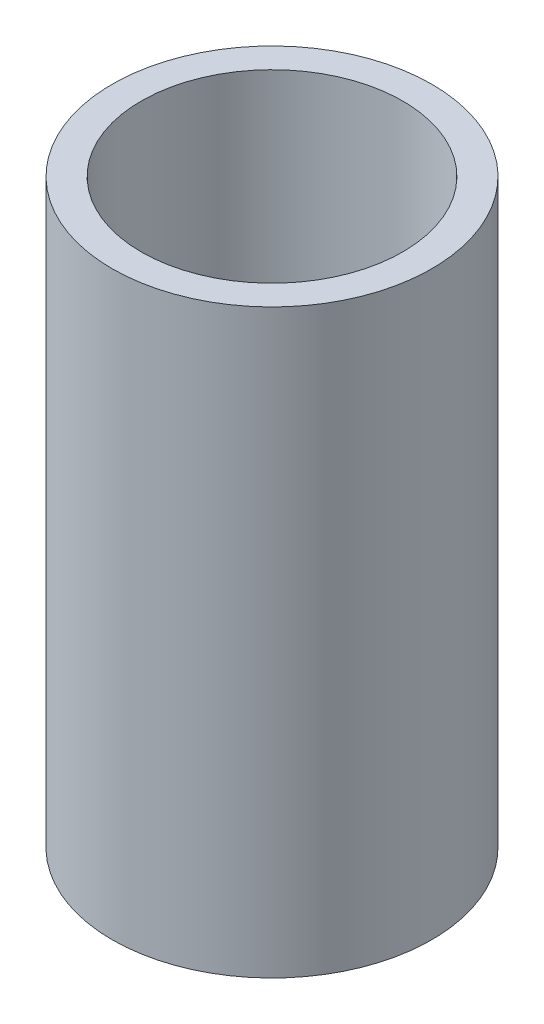
ISO-10303-21;
HEADER;
FILE_DESCRIPTION(('STEP AP214'),'2;1');
FILE_NAME('part.step','',(''),(''),'','','');
FILE_SCHEMA(('AUTOMOTIVE_DESIGN { 1 0 10303 214 1 1 1 1 }'));
ENDSEC;
DATA;
#1=APPLICATION_CONTEXT('core data for automotive mechanical design processes');
#2=APPLICATION_PROTOCOL_DEFINITION('international standard','automotive_design',2000,#1);
#3=PRODUCT_CONTEXT('',#1,'mechanical');
#4=PRODUCT('Part','Part','',(#3));
#5=PRODUCT_RELATED_PRODUCT_CATEGORY('part','',(#4));
#6=PRODUCT_DEFINITION_FORMATION('','',#4);
#7=PRODUCT_DEFINITION_CONTEXT('part definition',#1,'design');
#8=PRODUCT_DEFINITION('design','',#6,#7);
#9=PRODUCT_DEFINITION_SHAPE('','',#8);
#10=(LENGTH_UNIT() NAMED_UNIT(*) SI_UNIT(.MILLI.,.METRE.));
#11=(NAMED_UNIT(*) PLANE_ANGLE_UNIT() SI_UNIT($,.RADIAN.));
#12=(NAMED_UNIT(*) SI_UNIT($,.STERADIAN.) SOLID_ANGLE_UNIT());
#13=UNCERTAINTY_MEASURE_WITH_UNIT(LENGTH_MEASURE(1.E-05),#10,'distance_accuracy_value','');
#14=(GEOMETRIC_REPRESENTATION_CONTEXT(3) GLOBAL_UNCERTAINTY_ASSIGNED_CONTEXT((#13)) GLOBAL_UNIT_ASSIGNED_CONTEXT((#10,
#11,#12)) REPRESENTATION_CONTEXT('',''));
#15=CARTESIAN_POINT('',(0.,0.,0.));
#16=DIRECTION('',(0.,0.,1.));
#17=DIRECTION('',(1.,0.,0.));
#18=AXIS2_PLACEMENT_3D('',#15,#16,#17);
#19=CARTESIAN_POINT('',(0.,10.,0.));
#20=DIRECTION('',(0.,1.,0.));
#21=DIRECTION('',(0.,0.,1.));
#22=AXIS2_PLACEMENT_3D('',#19,#20,#21);
#23=PLANE('',#22);
#24=CARTESIAN_POINT('',(0.,10.,0.));
#25=DIRECTION('',(0.,1.,0.));
#26=DIRECTION('',(0.,0.,1.));
#27=AXIS2_PLACEMENT_3D('',#24,#25,#26);
#28=CIRCLE('',#27,2.75);
#29=CARTESIAN_POINT('',(0.,10.,2.75));
#30=VERTEX_POINT('',#29);
#31=EDGE_CURVE('E10',#30,#30,#28,.T.);
#32=ORIENTED_EDGE('',*,*,#31,.T.);
#33=EDGE_LOOP('',(#32));
#34=FACE_BOUND('',#33,.T.);
#35=CARTESIAN_POINT('',(0.,10.,0.));
#36=DIRECTION('',(0.,1.,0.));
#37=DIRECTION('',(0.,0.,1.));
#38=AXIS2_PLACEMENT_3D('',#35,#36,#37);
#39=CIRCLE('',#38,2.25);
#40=CARTESIAN_POINT('',(0.,10.,2.25));
#41=VERTEX_POINT('',#40);
#42=EDGE_CURVE('E45',#41,#41,#39,.T.);
#43=ORIENTED_EDGE('',*,*,#42,.F.);
#44=EDGE_LOOP('',(#43));
#45=FACE_BOUND('',#44,.T.);
#46=ADVANCED_FACE('F34',(#34,#45),#23,.T.);
#47=CARTESIAN_POINT('',(0.,0.,0.));
#48=DIRECTION('',(0.,1.,0.));
#49=DIRECTION('',(0.,0.,1.));
#50=AXIS2_PLACEMENT_3D('',#47,#48,#49);
#51=PLANE('',#50);
#52=CARTESIAN_POINT('',(0.,0.,0.));
#53=DIRECTION('',(0.,1.,0.));
#54=DIRECTION('',(0.,0.,1.));
#55=AXIS2_PLACEMENT_3D('',#52,#53,#54);
#56=CIRCLE('',#55,2.75);
#57=CARTESIAN_POINT('',(0.,0.,2.75));
#58=VERTEX_POINT('',#57);
#59=EDGE_CURVE('E38',#58,#58,#56,.T.);
#60=ORIENTED_EDGE('',*,*,#59,.F.);
#61=EDGE_LOOP('',(#60));
#62=FACE_BOUND('',#61,.T.);
#63=CARTESIAN_POINT('',(0.,0.,0.));
#64=DIRECTION('',(0.,1.,0.));
#65=DIRECTION('',(0.,0.,1.));
#66=AXIS2_PLACEMENT_3D('',#63,#64,#65);
#67=CIRCLE('',#66,2.25);
#68=CARTESIAN_POINT('',(0.,0.,2.25));
#69=VERTEX_POINT('',#68);
#70=EDGE_CURVE('E47',#69,#69,#67,.T.);
#71=ORIENTED_EDGE('',*,*,#70,.T.);
#72=EDGE_LOOP('',(#71));
#73=FACE_BOUND('',#72,.T.);
#74=ADVANCED_FACE('F57',(#62,#73),#51,.F.);
#75=CARTESIAN_POINT('',(0.,10.,0.));
#76=DIRECTION('',(0.,-1.,0.));
#77=DIRECTION('',(0.,0.,-1.));
#78=AXIS2_PLACEMENT_3D('',#75,#76,#77);
#79=CYLINDRICAL_SURFACE('',#78,2.75);
#80=ORIENTED_EDGE('',*,*,#31,.F.);
#81=EDGE_LOOP('',(#80));
#82=FACE_BOUND('',#81,.T.);
#83=ORIENTED_EDGE('',*,*,#59,.T.);
#84=EDGE_LOOP('',(#83));
#85=FACE_BOUND('',#84,.T.);
#86=ADVANCED_FACE('F36',(#82,#85),#79,.T.);
#87=CARTESIAN_POINT('',(0.,10.,0.));
#88=DIRECTION('',(0.,-1.,0.));
#89=DIRECTION('',(0.,0.,-1.));
#90=AXIS2_PLACEMENT_3D('',#87,#88,#89);
#91=CYLINDRICAL_SURFACE('',#90,2.25);
#92=ORIENTED_EDGE('',*,*,#42,.T.);
#93=EDGE_LOOP('',(#92));
#94=FACE_BOUND('',#93,.T.);
#95=ORIENTED_EDGE('',*,*,#70,.F.);
#96=EDGE_LOOP('',(#95));
#97=FACE_BOUND('',#96,.T.);
#98=ADVANCED_FACE('F53',(#94,#97),#91,.F.);
#99=CLOSED_SHELL('',(#46,#74,#86,#98));
#100=MANIFOLD_SOLID_BREP('B2',#99);
#101=ADVANCED_BREP_SHAPE_REPRESENTATION('',(#18,#100),#14);
#102=SHAPE_DEFINITION_REPRESENTATION(#9,#101);
ENDSEC;
END-ISO-10303-21;
